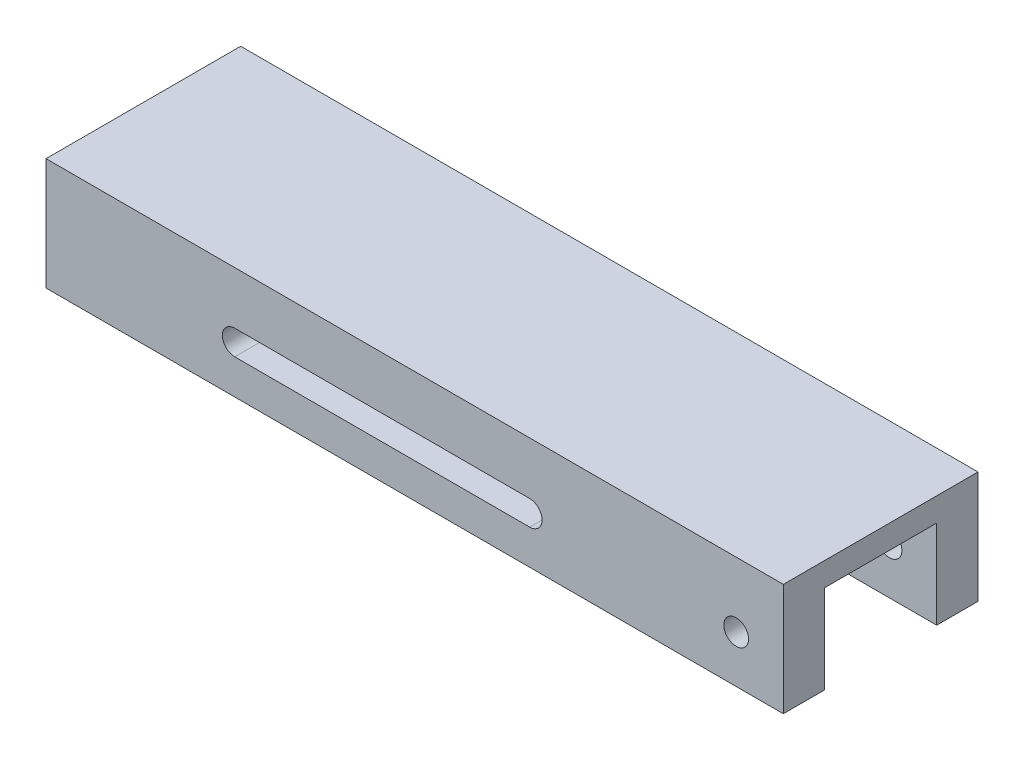
ISO-10303-21;
HEADER;
FILE_DESCRIPTION(('STEP AP214'),'2;1');
FILE_NAME('part.step','',(''),(''),'','','');
FILE_SCHEMA(('AUTOMOTIVE_DESIGN { 1 0 10303 214 1 1 1 1 }'));
ENDSEC;
DATA;
#1=APPLICATION_CONTEXT('core data for automotive mechanical design processes');
#2=APPLICATION_PROTOCOL_DEFINITION('international standard','automotive_design',2000,#1);
#3=PRODUCT_CONTEXT('',#1,'mechanical');
#4=PRODUCT('Part','Part','',(#3));
#5=PRODUCT_RELATED_PRODUCT_CATEGORY('part','',(#4));
#6=PRODUCT_DEFINITION_FORMATION('','',#4);
#7=PRODUCT_DEFINITION_CONTEXT('part definition',#1,'design');
#8=PRODUCT_DEFINITION('design','',#6,#7);
#9=PRODUCT_DEFINITION_SHAPE('','',#8);
#10=(LENGTH_UNIT() NAMED_UNIT(*) SI_UNIT(.MILLI.,.METRE.));
#11=(NAMED_UNIT(*) PLANE_ANGLE_UNIT() SI_UNIT($,.RADIAN.));
#12=(NAMED_UNIT(*) SI_UNIT($,.STERADIAN.) SOLID_ANGLE_UNIT());
#13=UNCERTAINTY_MEASURE_WITH_UNIT(LENGTH_MEASURE(1.E-05),#10,'distance_accuracy_value','');
#14=(GEOMETRIC_REPRESENTATION_CONTEXT(3) GLOBAL_UNCERTAINTY_ASSIGNED_CONTEXT((#13)) GLOBAL_UNIT_ASSIGNED_CONTEXT((#10,
#11,#12)) REPRESENTATION_CONTEXT('',''));
#15=CARTESIAN_POINT('',(0.,0.,0.));
#16=DIRECTION('',(0.,0.,1.));
#17=DIRECTION('',(1.,0.,0.));
#18=AXIS2_PLACEMENT_3D('',#15,#16,#17);
#19=CARTESIAN_POINT('',(125.,15.,-7.00000000000001));
#20=DIRECTION('',(0.,0.,1.));
#21=DIRECTION('',(1.,0.,0.));
#22=AXIS2_PLACEMENT_3D('',#19,#20,#21);
#23=PLANE('',#22);
#24=DIRECTION('',(1.,0.,0.));
#25=VECTOR('',#24,1.);
#26=CARTESIAN_POINT('',(125.,5.9,-7.00000000000001));
#27=LINE('',#26,#25);
#28=CARTESIAN_POINT('',(32.,5.89999999999999,-6.99999999999999));
#29=VERTEX_POINT('',#28);
#30=CARTESIAN_POINT('',(82.,5.89999999999999,-7.));
#31=VERTEX_POINT('',#30);
#32=EDGE_CURVE('E318',#29,#31,#27,.T.);
#33=ORIENTED_EDGE('',*,*,#32,.T.);
#34=CARTESIAN_POINT('',(82.,8.,-7.));
#35=DIRECTION('',(0.,0.,1.));
#36=DIRECTION('',(1.,0.,0.));
#37=AXIS2_PLACEMENT_3D('',#34,#35,#36);
#38=CIRCLE('',#37,2.1);
#39=CARTESIAN_POINT('',(82.,10.1,-7.));
#40=VERTEX_POINT('',#39);
#41=EDGE_CURVE('E326',#31,#40,#38,.T.);
#42=ORIENTED_EDGE('',*,*,#41,.T.);
#43=DIRECTION('',(-1.,0.,0.));
#44=VECTOR('',#43,1.);
#45=CARTESIAN_POINT('',(125.,10.1,-7.00000000000001));
#46=LINE('',#45,#44);
#47=CARTESIAN_POINT('',(32.,10.1,-6.99999999999999));
#48=VERTEX_POINT('',#47);
#49=EDGE_CURVE('E302',#40,#48,#46,.T.);
#50=ORIENTED_EDGE('',*,*,#49,.T.);
#51=CARTESIAN_POINT('',(32.,7.99999999999999,-6.99999999999999));
#52=DIRECTION('',(0.,0.,1.));
#53=DIRECTION('',(1.,0.,0.));
#54=AXIS2_PLACEMENT_3D('',#51,#52,#53);
#55=CIRCLE('',#54,2.1);
#56=EDGE_CURVE('E310',#48,#29,#55,.T.);
#57=ORIENTED_EDGE('',*,*,#56,.T.);
#58=EDGE_LOOP('',(#33,#42,#50,#57));
#59=FACE_BOUND('',#58,.T.);
#60=DIRECTION('',(0.,1.,0.));
#61=VECTOR('',#60,1.);
#62=CARTESIAN_POINT('',(90.,0.,-7.00000000000001));
#63=LINE('',#62,#61);
#64=CARTESIAN_POINT('',(90.,0.,-7.));
#65=VERTEX_POINT('',#64);
#66=CARTESIAN_POINT('',(90.,15.,-7.));
#67=VERTEX_POINT('',#66);
#68=EDGE_CURVE('E55',#65,#67,#63,.T.);
#69=ORIENTED_EDGE('',*,*,#68,.F.);
#70=DIRECTION('',(-1.,0.,0.));
#71=VECTOR('',#70,1.);
#72=CARTESIAN_POINT('',(125.,0.,-7.00000000000001));
#73=LINE('',#72,#71);
#74=CARTESIAN_POINT('',(7.,0.,-6.99999999999999));
#75=VERTEX_POINT('',#74);
#76=EDGE_CURVE('E357',#65,#75,#73,.T.);
#77=ORIENTED_EDGE('',*,*,#76,.T.);
#78=DIRECTION('',(0.,-1.,0.));
#79=VECTOR('',#78,1.);
#80=CARTESIAN_POINT('',(7.,15.,-6.99999999999999));
#81=LINE('',#80,#79);
#82=CARTESIAN_POINT('',(7.,15.,-6.99999999999999));
#83=VERTEX_POINT('',#82);
#84=EDGE_CURVE('E388',#83,#75,#81,.T.);
#85=ORIENTED_EDGE('',*,*,#84,.F.);
#86=DIRECTION('',(-1.,0.,0.));
#87=VECTOR('',#86,1.);
#88=CARTESIAN_POINT('',(125.,15.,-7.00000000000001));
#89=LINE('',#88,#87);
#90=EDGE_CURVE('E189',#67,#83,#89,.T.);
#91=ORIENTED_EDGE('',*,*,#90,.F.);
#92=EDGE_LOOP('',(#69,#77,#85,#91));
#93=FACE_BOUND('',#92,.T.);
#94=ADVANCED_FACE('F39',(#59,#93),#23,.F.);
#95=CARTESIAN_POINT('',(117.,8.,-7.00000000000001));
#96=DIRECTION('',(0.,0.,1.));
#97=DIRECTION('',(1.,0.,0.));
#98=AXIS2_PLACEMENT_3D('',#95,#96,#97);
#99=CIRCLE('',#98,2.09999999999999);
#100=CARTESIAN_POINT('',(119.1,8.,-7.00000000000001));
#101=VERTEX_POINT('',#100);
#102=EDGE_CURVE('E334',#101,#101,#99,.T.);
#103=ORIENTED_EDGE('',*,*,#102,.T.);
#104=EDGE_LOOP('',(#103));
#105=FACE_BOUND('',#104,.T.);
#106=DIRECTION('',(0.,1.,0.));
#107=VECTOR('',#106,1.);
#108=CARTESIAN_POINT('',(97.,0.,-7.00000000000001));
#109=LINE('',#108,#107);
#110=CARTESIAN_POINT('',(97.,0.,-7.));
#111=VERTEX_POINT('',#110);
#112=CARTESIAN_POINT('',(97.,15.,-7.00000000000001));
#113=VERTEX_POINT('',#112);
#114=EDGE_CURVE('E192',#111,#113,#109,.T.);
#115=ORIENTED_EDGE('',*,*,#114,.T.);
#116=CARTESIAN_POINT('',(125.,15.,-7.00000000000001));
#117=VERTEX_POINT('',#116);
#118=EDGE_CURVE('E180',#117,#113,#89,.T.);
#119=ORIENTED_EDGE('',*,*,#118,.F.);
#120=DIRECTION('',(0.,-1.,0.));
#121=VECTOR('',#120,1.);
#122=CARTESIAN_POINT('',(125.,15.,-7.00000000000001));
#123=LINE('',#122,#121);
#124=CARTESIAN_POINT('',(125.,0.,-7.00000000000001));
#125=VERTEX_POINT('',#124);
#126=EDGE_CURVE('E392',#117,#125,#123,.T.);
#127=ORIENTED_EDGE('',*,*,#126,.T.);
#128=EDGE_CURVE('E63',#125,#111,#73,.T.);
#129=ORIENTED_EDGE('',*,*,#128,.T.);
#130=EDGE_LOOP('',(#115,#119,#127,#129));
#131=FACE_BOUND('',#130,.T.);
#132=ADVANCED_FACE('F193',(#105,#131),#23,.F.);
#133=CARTESIAN_POINT('',(125.,15.,-26.));
#134=DIRECTION('',(0.,0.,-1.));
#135=DIRECTION('',(-1.,0.,0.));
#136=AXIS2_PLACEMENT_3D('',#133,#134,#135);
#137=PLANE('',#136);
#138=DIRECTION('',(1.,0.,0.));
#139=VECTOR('',#138,1.);
#140=CARTESIAN_POINT('',(125.,10.1,-26.));
#141=LINE('',#140,#139);
#142=CARTESIAN_POINT('',(32.,10.1,-26.));
#143=VERTEX_POINT('',#142);
#144=CARTESIAN_POINT('',(82.,10.1,-26.));
#145=VERTEX_POINT('',#144);
#146=EDGE_CURVE('E245',#143,#145,#141,.T.);
#147=ORIENTED_EDGE('',*,*,#146,.T.);
#148=CARTESIAN_POINT('',(82.,8.,-26.));
#149=DIRECTION('',(0.,0.,-1.));
#150=DIRECTION('',(-1.,0.,0.));
#151=AXIS2_PLACEMENT_3D('',#148,#149,#150);
#152=CIRCLE('',#151,2.1);
#153=CARTESIAN_POINT('',(82.,5.89999999999999,-26.));
#154=VERTEX_POINT('',#153);
#155=EDGE_CURVE('E322',#145,#154,#152,.T.);
#156=ORIENTED_EDGE('',*,*,#155,.T.);
#157=DIRECTION('',(-1.,0.,0.));
#158=VECTOR('',#157,1.);
#159=CARTESIAN_POINT('',(125.,5.9,-26.));
#160=LINE('',#159,#158);
#161=CARTESIAN_POINT('',(32.,5.89999999999999,-26.));
#162=VERTEX_POINT('',#161);
#163=EDGE_CURVE('E314',#154,#162,#160,.T.);
#164=ORIENTED_EDGE('',*,*,#163,.T.);
#165=CARTESIAN_POINT('',(32.,7.99999999999999,-26.));
#166=DIRECTION('',(0.,0.,-1.));
#167=DIRECTION('',(-1.,0.,0.));
#168=AXIS2_PLACEMENT_3D('',#165,#166,#167);
#169=CIRCLE('',#168,2.1);
#170=EDGE_CURVE('E306',#162,#143,#169,.T.);
#171=ORIENTED_EDGE('',*,*,#170,.T.);
#172=EDGE_LOOP('',(#147,#156,#164,#171));
#173=FACE_BOUND('',#172,.T.);
#174=DIRECTION('',(0.,1.,0.));
#175=VECTOR('',#174,1.);
#176=CARTESIAN_POINT('',(90.,0.,-26.));
#177=LINE('',#176,#175);
#178=CARTESIAN_POINT('',(90.,0.,-26.));
#179=VERTEX_POINT('',#178);
#180=CARTESIAN_POINT('',(90.,15.,-26.));
#181=VERTEX_POINT('',#180);
#182=EDGE_CURVE('E219',#179,#181,#177,.T.);
#183=ORIENTED_EDGE('',*,*,#182,.T.);
#184=DIRECTION('',(1.,0.,0.));
#185=VECTOR('',#184,1.);
#186=CARTESIAN_POINT('',(125.,15.,-26.));
#187=LINE('',#186,#185);
#188=CARTESIAN_POINT('',(7.00000000000001,15.,-26.));
#189=VERTEX_POINT('',#188);
#190=EDGE_CURVE('E343',#189,#181,#187,.T.);
#191=ORIENTED_EDGE('',*,*,#190,.F.);
#192=DIRECTION('',(0.,-1.,0.));
#193=VECTOR('',#192,1.);
#194=CARTESIAN_POINT('',(7.00000000000001,15.,-26.));
#195=LINE('',#194,#193);
#196=CARTESIAN_POINT('',(7.00000000000001,0.,-26.));
#197=VERTEX_POINT('',#196);
#198=EDGE_CURVE('E384',#189,#197,#195,.T.);
#199=ORIENTED_EDGE('',*,*,#198,.T.);
#200=DIRECTION('',(1.,0.,0.));
#201=VECTOR('',#200,1.);
#202=CARTESIAN_POINT('',(125.,0.,-26.));
#203=LINE('',#202,#201);
#204=EDGE_CURVE('E364',#197,#179,#203,.T.);
#205=ORIENTED_EDGE('',*,*,#204,.T.);
#206=EDGE_LOOP('',(#183,#191,#199,#205));
#207=FACE_BOUND('',#206,.T.);
#208=ADVANCED_FACE('F446',(#173,#207),#137,.F.);
#209=CARTESIAN_POINT('',(117.,8.,-26.));
#210=DIRECTION('',(0.,0.,-1.));
#211=DIRECTION('',(-1.,0.,0.));
#212=AXIS2_PLACEMENT_3D('',#209,#210,#211);
#213=CIRCLE('',#212,2.09999999999999);
#214=CARTESIAN_POINT('',(114.9,8.,-26.));
#215=VERTEX_POINT('',#214);
#216=EDGE_CURVE('E330',#215,#215,#213,.T.);
#217=ORIENTED_EDGE('',*,*,#216,.T.);
#218=EDGE_LOOP('',(#217));
#219=FACE_BOUND('',#218,.T.);
#220=DIRECTION('',(0.,1.,0.));
#221=VECTOR('',#220,1.);
#222=CARTESIAN_POINT('',(97.,0.,-26.));
#223=LINE('',#222,#221);
#224=CARTESIAN_POINT('',(97.,0.,-26.));
#225=VERTEX_POINT('',#224);
#226=CARTESIAN_POINT('',(97.,15.,-26.));
#227=VERTEX_POINT('',#226);
#228=EDGE_CURVE('E197',#225,#227,#223,.T.);
#229=ORIENTED_EDGE('',*,*,#228,.F.);
#230=CARTESIAN_POINT('',(125.,0.,-26.));
#231=VERTEX_POINT('',#230);
#232=EDGE_CURVE('E363',#225,#231,#203,.T.);
#233=ORIENTED_EDGE('',*,*,#232,.T.);
#234=DIRECTION('',(0.,-1.,0.));
#235=VECTOR('',#234,1.);
#236=CARTESIAN_POINT('',(125.,15.,-26.));
#237=LINE('',#236,#235);
#238=CARTESIAN_POINT('',(125.,15.,-26.));
#239=VERTEX_POINT('',#238);
#240=EDGE_CURVE('E380',#239,#231,#237,.T.);
#241=ORIENTED_EDGE('',*,*,#240,.F.);
#242=EDGE_CURVE('E342',#227,#239,#187,.T.);
#243=ORIENTED_EDGE('',*,*,#242,.F.);
#244=EDGE_LOOP('',(#229,#233,#241,#243));
#245=FACE_BOUND('',#244,.T.);
#246=ADVANCED_FACE('F531',(#219,#245),#137,.F.);
#247=CARTESIAN_POINT('',(0.,15.,0.));
#248=DIRECTION('',(0.,1.,0.));
#249=DIRECTION('',(0.,0.,1.));
#250=AXIS2_PLACEMENT_3D('',#247,#248,#249);
#251=PLANE('',#250);
#252=DIRECTION('',(0.,0.,-1.));
#253=VECTOR('',#252,1.);
#254=CARTESIAN_POINT('',(90.,15.,-7.00000000000001));
#255=LINE('',#254,#253);
#256=EDGE_CURVE('E203',#67,#181,#255,.T.);
#257=ORIENTED_EDGE('',*,*,#256,.F.);
#258=ORIENTED_EDGE('',*,*,#90,.T.);
#259=DIRECTION('',(0.,0.,-1.));
#260=VECTOR('',#259,1.);
#261=CARTESIAN_POINT('',(7.00000000000001,15.,-26.));
#262=LINE('',#261,#260);
#263=EDGE_CURVE('E188',#83,#189,#262,.T.);
#264=ORIENTED_EDGE('',*,*,#263,.T.);
#265=ORIENTED_EDGE('',*,*,#190,.T.);
#266=EDGE_LOOP('',(#257,#258,#264,#265));
#267=FACE_BOUND('',#266,.T.);
#268=ADVANCED_FACE('F452',(#267),#251,.F.);
#269=DIRECTION('',(0.,0.,1.));
#270=VECTOR('',#269,1.);
#271=CARTESIAN_POINT('',(97.,15.,-7.00000000000001));
#272=LINE('',#271,#270);
#273=EDGE_CURVE('E183',#227,#113,#272,.T.);
#274=ORIENTED_EDGE('',*,*,#273,.F.);
#275=ORIENTED_EDGE('',*,*,#242,.T.);
#276=DIRECTION('',(0.,0.,-1.));
#277=VECTOR('',#276,1.);
#278=CARTESIAN_POINT('',(125.,15.,-33.));
#279=LINE('',#278,#277);
#280=EDGE_CURVE('E186',#117,#239,#279,.T.);
#281=ORIENTED_EDGE('',*,*,#280,.F.);
#282=ORIENTED_EDGE('',*,*,#118,.T.);
#283=EDGE_LOOP('',(#274,#275,#281,#282));
#284=FACE_BOUND('',#283,.T.);
#285=ADVANCED_FACE('F181',(#284),#251,.F.);
#286=CARTESIAN_POINT('',(0.,15.,0.));
#287=DIRECTION('',(1.,0.,0.));
#288=DIRECTION('',(0.,0.,-1.));
#289=AXIS2_PLACEMENT_3D('',#286,#287,#288);
#290=PLANE('',#289);
#291=CARTESIAN_POINT('',(0.,8.,-16.5));
#292=DIRECTION('',(1.,0.,0.));
#293=DIRECTION('',(0.,0.,-1.));
#294=AXIS2_PLACEMENT_3D('',#291,#292,#293);
#295=CIRCLE('',#294,3.575);
#296=CARTESIAN_POINT('',(0.,8.,-20.075));
#297=VERTEX_POINT('',#296);
#298=EDGE_CURVE('E421',#297,#297,#295,.T.);
#299=ORIENTED_EDGE('',*,*,#298,.T.);
#300=EDGE_LOOP('',(#299));
#301=FACE_BOUND('',#300,.T.);
#302=DIRECTION('',(0.,0.,1.));
#303=VECTOR('',#302,1.);
#304=CARTESIAN_POINT('',(0.,0.,0.));
#305=LINE('',#304,#303);
#306=CARTESIAN_POINT('',(0.,0.,-33.));
#307=VERTEX_POINT('',#306);
#308=CARTESIAN_POINT('',(0.,0.,0.));
#309=VERTEX_POINT('',#308);
#310=EDGE_CURVE('E337',#307,#309,#305,.T.);
#311=ORIENTED_EDGE('',*,*,#310,.T.);
#312=DIRECTION('',(0.,-1.,0.));
#313=VECTOR('',#312,1.);
#314=CARTESIAN_POINT('',(0.,15.,0.));
#315=LINE('',#314,#313);
#316=CARTESIAN_POINT('',(0.,19.,0.));
#317=VERTEX_POINT('',#316);
#318=EDGE_CURVE('E11',#317,#309,#315,.T.);
#319=ORIENTED_EDGE('',*,*,#318,.F.);
#320=DIRECTION('',(0.,0.,1.));
#321=VECTOR('',#320,1.);
#322=CARTESIAN_POINT('',(0.,19.,-33.));
#323=LINE('',#322,#321);
#324=CARTESIAN_POINT('',(0.,19.,-33.));
#325=VERTEX_POINT('',#324);
#326=EDGE_CURVE('E222',#325,#317,#323,.T.);
#327=ORIENTED_EDGE('',*,*,#326,.F.);
#328=DIRECTION('',(0.,-1.,0.));
#329=VECTOR('',#328,1.);
#330=CARTESIAN_POINT('',(0.,15.,-33.));
#331=LINE('',#330,#329);
#332=EDGE_CURVE('E347',#325,#307,#331,.T.);
#333=ORIENTED_EDGE('',*,*,#332,.T.);
#334=EDGE_LOOP('',(#311,#319,#327,#333));
#335=FACE_BOUND('',#334,.T.);
#336=ADVANCED_FACE('F41',(#301,#335),#290,.F.);
#337=CARTESIAN_POINT('',(0.,15.,0.));
#338=DIRECTION('',(0.,0.,-1.));
#339=DIRECTION('',(-1.,0.,0.));
#340=AXIS2_PLACEMENT_3D('',#337,#338,#339);
#341=PLANE('',#340);
#342=CARTESIAN_POINT('',(117.,8.,0.));
#343=DIRECTION('',(0.,0.,1.));
#344=DIRECTION('',(1.,0.,0.));
#345=AXIS2_PLACEMENT_3D('',#342,#343,#344);
#346=CIRCLE('',#345,2.09999999999999);
#347=CARTESIAN_POINT('',(119.1,8.,0.));
#348=VERTEX_POINT('',#347);
#349=EDGE_CURVE('E246',#348,#348,#346,.T.);
#350=ORIENTED_EDGE('',*,*,#349,.F.);
#351=EDGE_LOOP('',(#350));
#352=FACE_BOUND('',#351,.T.);
#353=DIRECTION('',(-1.,0.,0.));
#354=VECTOR('',#353,1.);
#355=CARTESIAN_POINT('',(82.,10.1,0.));
#356=LINE('',#355,#354);
#357=CARTESIAN_POINT('',(82.,10.1,0.));
#358=VERTEX_POINT('',#357);
#359=CARTESIAN_POINT('',(32.,10.1,0.));
#360=VERTEX_POINT('',#359);
#361=EDGE_CURVE('E271',#358,#360,#356,.T.);
#362=ORIENTED_EDGE('',*,*,#361,.F.);
#363=CARTESIAN_POINT('',(82.,8.,0.));
#364=DIRECTION('',(0.,0.,1.));
#365=DIRECTION('',(1.,0.,0.));
#366=AXIS2_PLACEMENT_3D('',#363,#364,#365);
#367=CIRCLE('',#366,2.1);
#368=CARTESIAN_POINT('',(82.,5.89999999999999,0.));
#369=VERTEX_POINT('',#368);
#370=EDGE_CURVE('E238',#369,#358,#367,.T.);
#371=ORIENTED_EDGE('',*,*,#370,.F.);
#372=DIRECTION('',(1.,0.,0.));
#373=VECTOR('',#372,1.);
#374=CARTESIAN_POINT('',(82.,5.89999999999999,0.));
#375=LINE('',#374,#373);
#376=CARTESIAN_POINT('',(32.,5.89999999999999,0.));
#377=VERTEX_POINT('',#376);
#378=EDGE_CURVE('E256',#377,#369,#375,.T.);
#379=ORIENTED_EDGE('',*,*,#378,.F.);
#380=CARTESIAN_POINT('',(32.,7.99999999999999,0.));
#381=DIRECTION('',(0.,0.,1.));
#382=DIRECTION('',(1.,0.,0.));
#383=AXIS2_PLACEMENT_3D('',#380,#381,#382);
#384=CIRCLE('',#383,2.1);
#385=EDGE_CURVE('E275',#360,#377,#384,.T.);
#386=ORIENTED_EDGE('',*,*,#385,.F.);
#387=EDGE_LOOP('',(#362,#371,#379,#386));
#388=FACE_BOUND('',#387,.T.);
#389=DIRECTION('',(1.,0.,0.));
#390=VECTOR('',#389,1.);
#391=CARTESIAN_POINT('',(0.,0.,0.));
#392=LINE('',#391,#390);
#393=CARTESIAN_POINT('',(125.,0.,0.));
#394=VERTEX_POINT('',#393);
#395=EDGE_CURVE('E351',#309,#394,#392,.T.);
#396=ORIENTED_EDGE('',*,*,#395,.T.);
#397=DIRECTION('',(0.,-1.,0.));
#398=VECTOR('',#397,1.);
#399=CARTESIAN_POINT('',(125.,15.,0.));
#400=LINE('',#399,#398);
#401=CARTESIAN_POINT('',(125.,19.,0.));
#402=VERTEX_POINT('',#401);
#403=EDGE_CURVE('E48',#402,#394,#400,.T.);
#404=ORIENTED_EDGE('',*,*,#403,.F.);
#405=DIRECTION('',(1.,0.,0.));
#406=VECTOR('',#405,1.);
#407=CARTESIAN_POINT('',(0.,19.,0.));
#408=LINE('',#407,#406);
#409=EDGE_CURVE('E226',#317,#402,#408,.T.);
#410=ORIENTED_EDGE('',*,*,#409,.F.);
#411=ORIENTED_EDGE('',*,*,#318,.T.);
#412=EDGE_LOOP('',(#396,#404,#410,#411));
#413=FACE_BOUND('',#412,.T.);
#414=ADVANCED_FACE('F438',(#352,#388,#413),#341,.F.);
#415=CARTESIAN_POINT('',(7.00000000000001,15.,-26.));
#416=DIRECTION('',(-1.,0.,0.));
#417=DIRECTION('',(0.,0.,1.));
#418=AXIS2_PLACEMENT_3D('',#415,#416,#417);
#419=PLANE('',#418);
#420=CARTESIAN_POINT('',(7.00000000000001,8.,-16.5));
#421=DIRECTION('',(-1.,0.,0.));
#422=DIRECTION('',(0.,0.,1.));
#423=AXIS2_PLACEMENT_3D('',#420,#421,#422);
#424=CIRCLE('',#423,3.575);
#425=CARTESIAN_POINT('',(7.00000000000001,8.,-12.925));
#426=VERTEX_POINT('',#425);
#427=EDGE_CURVE('E211',#426,#426,#424,.F.);
#428=ORIENTED_EDGE('',*,*,#427,.F.);
#429=EDGE_LOOP('',(#428));
#430=FACE_BOUND('',#429,.T.);
#431=DIRECTION('',(0.,0.,-1.));
#432=VECTOR('',#431,1.);
#433=CARTESIAN_POINT('',(7.00000000000001,0.,-26.));
#434=LINE('',#433,#432);
#435=EDGE_CURVE('E360',#75,#197,#434,.T.);
#436=ORIENTED_EDGE('',*,*,#435,.T.);
#437=ORIENTED_EDGE('',*,*,#198,.F.);
#438=ORIENTED_EDGE('',*,*,#263,.F.);
#439=ORIENTED_EDGE('',*,*,#84,.T.);
#440=EDGE_LOOP('',(#436,#437,#438,#439));
#441=FACE_BOUND('',#440,.T.);
#442=ADVANCED_FACE('F435',(#430,#441),#419,.F.);
#443=CARTESIAN_POINT('',(125.,15.,-26.));
#444=DIRECTION('',(-1.,0.,0.));
#445=DIRECTION('',(0.,0.,1.));
#446=AXIS2_PLACEMENT_3D('',#443,#444,#445);
#447=PLANE('',#446);
#448=DIRECTION('',(0.,0.,-1.));
#449=VECTOR('',#448,1.);
#450=CARTESIAN_POINT('',(125.,0.,-26.));
#451=LINE('',#450,#449);
#452=CARTESIAN_POINT('',(125.,0.,-33.));
#453=VERTEX_POINT('',#452);
#454=EDGE_CURVE('E367',#231,#453,#451,.T.);
#455=ORIENTED_EDGE('',*,*,#454,.T.);
#456=DIRECTION('',(0.,-1.,0.));
#457=VECTOR('',#456,1.);
#458=CARTESIAN_POINT('',(125.,15.,-33.));
#459=LINE('',#458,#457);
#460=CARTESIAN_POINT('',(125.,19.,-33.));
#461=VERTEX_POINT('',#460);
#462=EDGE_CURVE('E376',#461,#453,#459,.T.);
#463=ORIENTED_EDGE('',*,*,#462,.F.);
#464=DIRECTION('',(0.,0.,-1.));
#465=VECTOR('',#464,1.);
#466=CARTESIAN_POINT('',(125.,19.,-33.));
#467=LINE('',#466,#465);
#468=EDGE_CURVE('E230',#402,#461,#467,.T.);
#469=ORIENTED_EDGE('',*,*,#468,.F.);
#470=ORIENTED_EDGE('',*,*,#403,.T.);
#471=DIRECTION('',(0.,0.,-1.));
#472=VECTOR('',#471,1.);
#473=CARTESIAN_POINT('',(125.,0.,0.));
#474=LINE('',#473,#472);
#475=EDGE_CURVE('E354',#394,#125,#474,.T.);
#476=ORIENTED_EDGE('',*,*,#475,.T.);
#477=ORIENTED_EDGE('',*,*,#126,.F.);
#478=ORIENTED_EDGE('',*,*,#280,.T.);
#479=ORIENTED_EDGE('',*,*,#240,.T.);
#480=EDGE_LOOP('',(#455,#463,#469,#470,#476,#477,#478,#479));
#481=FACE_BOUND('',#480,.T.);
#482=ADVANCED_FACE('F399',(#481),#447,.F.);
#483=CARTESIAN_POINT('',(0.,15.,-33.));
#484=DIRECTION('',(0.,0.,1.));
#485=DIRECTION('',(1.,0.,0.));
#486=AXIS2_PLACEMENT_3D('',#483,#484,#485);
#487=PLANE('',#486);
#488=CARTESIAN_POINT('',(117.,8.,-33.));
#489=DIRECTION('',(0.,0.,1.));
#490=DIRECTION('',(1.,0.,0.));
#491=AXIS2_PLACEMENT_3D('',#488,#489,#490);
#492=CIRCLE('',#491,2.09999999999999);
#493=CARTESIAN_POINT('',(119.1,8.,-33.));
#494=VERTEX_POINT('',#493);
#495=EDGE_CURVE('E241',#494,#494,#492,.T.);
#496=ORIENTED_EDGE('',*,*,#495,.T.);
#497=EDGE_LOOP('',(#496));
#498=FACE_BOUND('',#497,.T.);
#499=DIRECTION('',(1.,0.,0.));
#500=VECTOR('',#499,1.);
#501=CARTESIAN_POINT('',(82.,5.89999999999999,-33.));
#502=LINE('',#501,#500);
#503=CARTESIAN_POINT('',(32.,5.89999999999999,-33.));
#504=VERTEX_POINT('',#503);
#505=CARTESIAN_POINT('',(82.,5.89999999999999,-33.));
#506=VERTEX_POINT('',#505);
#507=EDGE_CURVE('E264',#504,#506,#502,.T.);
#508=ORIENTED_EDGE('',*,*,#507,.T.);
#509=CARTESIAN_POINT('',(82.,8.,-33.));
#510=DIRECTION('',(0.,0.,1.));
#511=DIRECTION('',(1.,0.,0.));
#512=AXIS2_PLACEMENT_3D('',#509,#510,#511);
#513=CIRCLE('',#512,2.1);
#514=CARTESIAN_POINT('',(82.,10.1,-33.));
#515=VERTEX_POINT('',#514);
#516=EDGE_CURVE('E251',#506,#515,#513,.T.);
#517=ORIENTED_EDGE('',*,*,#516,.T.);
#518=DIRECTION('',(-1.,0.,0.));
#519=VECTOR('',#518,1.);
#520=CARTESIAN_POINT('',(82.,10.1,-33.));
#521=LINE('',#520,#519);
#522=CARTESIAN_POINT('',(32.,10.1,-33.));
#523=VERTEX_POINT('',#522);
#524=EDGE_CURVE('E255',#515,#523,#521,.T.);
#525=ORIENTED_EDGE('',*,*,#524,.T.);
#526=CARTESIAN_POINT('',(32.,7.99999999999999,-33.));
#527=DIRECTION('',(0.,0.,1.));
#528=DIRECTION('',(1.,0.,0.));
#529=AXIS2_PLACEMENT_3D('',#526,#527,#528);
#530=CIRCLE('',#529,2.1);
#531=EDGE_CURVE('E260',#523,#504,#530,.T.);
#532=ORIENTED_EDGE('',*,*,#531,.T.);
#533=EDGE_LOOP('',(#508,#517,#525,#532));
#534=FACE_BOUND('',#533,.T.);
#535=DIRECTION('',(-1.,0.,0.));
#536=VECTOR('',#535,1.);
#537=CARTESIAN_POINT('',(0.,0.,-33.));
#538=LINE('',#537,#536);
#539=EDGE_CURVE('E370',#453,#307,#538,.T.);
#540=ORIENTED_EDGE('',*,*,#539,.T.);
#541=ORIENTED_EDGE('',*,*,#332,.F.);
#542=DIRECTION('',(-1.,0.,0.));
#543=VECTOR('',#542,1.);
#544=CARTESIAN_POINT('',(0.,19.,-33.));
#545=LINE('',#544,#543);
#546=EDGE_CURVE('E234',#461,#325,#545,.T.);
#547=ORIENTED_EDGE('',*,*,#546,.F.);
#548=ORIENTED_EDGE('',*,*,#462,.T.);
#549=EDGE_LOOP('',(#540,#541,#547,#548));
#550=FACE_BOUND('',#549,.T.);
#551=ADVANCED_FACE('F539',(#498,#534,#550),#487,.F.);
#552=CARTESIAN_POINT('',(0.,0.,0.));
#553=DIRECTION('',(0.,-1.,0.));
#554=DIRECTION('',(0.,0.,-1.));
#555=AXIS2_PLACEMENT_3D('',#552,#553,#554);
#556=PLANE('',#555);
#557=ORIENTED_EDGE('',*,*,#232,.F.);
#558=DIRECTION('',(0.,0.,1.));
#559=VECTOR('',#558,1.);
#560=CARTESIAN_POINT('',(97.,0.,-7.00000000000001));
#561=LINE('',#560,#559);
#562=EDGE_CURVE('E208',#225,#111,#561,.T.);
#563=ORIENTED_EDGE('',*,*,#562,.T.);
#564=ORIENTED_EDGE('',*,*,#128,.F.);
#565=ORIENTED_EDGE('',*,*,#475,.F.);
#566=ORIENTED_EDGE('',*,*,#395,.F.);
#567=ORIENTED_EDGE('',*,*,#310,.F.);
#568=ORIENTED_EDGE('',*,*,#539,.F.);
#569=ORIENTED_EDGE('',*,*,#454,.F.);
#570=EDGE_LOOP('',(#557,#563,#564,#565,#566,#567,#568,#569));
#571=FACE_BOUND('',#570,.T.);
#572=DIRECTION('',(0.,0.,-1.));
#573=VECTOR('',#572,1.);
#574=CARTESIAN_POINT('',(90.,0.,-7.00000000000001));
#575=LINE('',#574,#573);
#576=EDGE_CURVE('E202',#65,#179,#575,.T.);
#577=ORIENTED_EDGE('',*,*,#576,.T.);
#578=ORIENTED_EDGE('',*,*,#204,.F.);
#579=ORIENTED_EDGE('',*,*,#435,.F.);
#580=ORIENTED_EDGE('',*,*,#76,.F.);
#581=EDGE_LOOP('',(#577,#578,#579,#580));
#582=FACE_BOUND('',#581,.T.);
#583=ADVANCED_FACE('F404',(#571,#582),#556,.T.);
#584=CARTESIAN_POINT('',(82.,10.1,-33.));
#585=DIRECTION('',(0.,1.,0.));
#586=DIRECTION('',(-1.,0.,0.));
#587=AXIS2_PLACEMENT_3D('',#584,#585,#586);
#588=PLANE('',#587);
#589=DIRECTION('',(0.,0.,1.));
#590=VECTOR('',#589,1.);
#591=CARTESIAN_POINT('',(32.,10.1,-33.));
#592=LINE('',#591,#590);
#593=EDGE_CURVE('E291',#523,#143,#592,.T.);
#594=ORIENTED_EDGE('',*,*,#593,.F.);
#595=ORIENTED_EDGE('',*,*,#524,.F.);
#596=DIRECTION('',(0.,0.,1.));
#597=VECTOR('',#596,1.);
#598=CARTESIAN_POINT('',(82.,10.1,-33.));
#599=LINE('',#598,#597);
#600=EDGE_CURVE('E296',#515,#145,#599,.T.);
#601=ORIENTED_EDGE('',*,*,#600,.T.);
#602=ORIENTED_EDGE('',*,*,#146,.F.);
#603=EDGE_LOOP('',(#594,#595,#601,#602));
#604=FACE_BOUND('',#603,.T.);
#605=ADVANCED_FACE('F519',(#604),#588,.F.);
#606=CARTESIAN_POINT('',(32.,7.99999999999999,-33.));
#607=DIRECTION('',(0.,0.,1.));
#608=DIRECTION('',(1.,0.,0.));
#609=AXIS2_PLACEMENT_3D('',#606,#607,#608);
#610=CYLINDRICAL_SURFACE('',#609,2.1);
#611=DIRECTION('',(0.,0.,1.));
#612=VECTOR('',#611,1.);
#613=CARTESIAN_POINT('',(32.,5.89999999999999,-33.));
#614=LINE('',#613,#612);
#615=EDGE_CURVE('E286',#504,#162,#614,.T.);
#616=ORIENTED_EDGE('',*,*,#615,.F.);
#617=ORIENTED_EDGE('',*,*,#531,.F.);
#618=ORIENTED_EDGE('',*,*,#593,.T.);
#619=ORIENTED_EDGE('',*,*,#170,.F.);
#620=EDGE_LOOP('',(#616,#617,#618,#619));
#621=FACE_BOUND('',#620,.T.);
#622=ADVANCED_FACE('F486',(#621),#610,.F.);
#623=CARTESIAN_POINT('',(82.,5.89999999999999,-33.));
#624=DIRECTION('',(0.,-1.,0.));
#625=DIRECTION('',(1.,0.,0.));
#626=AXIS2_PLACEMENT_3D('',#623,#624,#625);
#627=PLANE('',#626);
#628=DIRECTION('',(0.,0.,1.));
#629=VECTOR('',#628,1.);
#630=CARTESIAN_POINT('',(82.,5.89999999999999,-33.));
#631=LINE('',#630,#629);
#632=EDGE_CURVE('E250',#506,#154,#631,.T.);
#633=ORIENTED_EDGE('',*,*,#632,.F.);
#634=ORIENTED_EDGE('',*,*,#507,.F.);
#635=ORIENTED_EDGE('',*,*,#615,.T.);
#636=ORIENTED_EDGE('',*,*,#163,.F.);
#637=EDGE_LOOP('',(#633,#634,#635,#636));
#638=FACE_BOUND('',#637,.T.);
#639=ADVANCED_FACE('F480',(#638),#627,.F.);
#640=CARTESIAN_POINT('',(82.,8.,-33.));
#641=DIRECTION('',(0.,0.,1.));
#642=DIRECTION('',(1.,0.,0.));
#643=AXIS2_PLACEMENT_3D('',#640,#641,#642);
#644=CYLINDRICAL_SURFACE('',#643,2.1);
#645=ORIENTED_EDGE('',*,*,#600,.F.);
#646=ORIENTED_EDGE('',*,*,#516,.F.);
#647=ORIENTED_EDGE('',*,*,#632,.T.);
#648=ORIENTED_EDGE('',*,*,#155,.F.);
#649=EDGE_LOOP('',(#645,#646,#647,#648));
#650=FACE_BOUND('',#649,.T.);
#651=ADVANCED_FACE('F489',(#650),#644,.F.);
#652=CARTESIAN_POINT('',(117.,8.,-33.));
#653=DIRECTION('',(0.,0.,1.));
#654=DIRECTION('',(1.,0.,0.));
#655=AXIS2_PLACEMENT_3D('',#652,#653,#654);
#656=CYLINDRICAL_SURFACE('',#655,2.09999999999999);
#657=ORIENTED_EDGE('',*,*,#495,.F.);
#658=EDGE_LOOP('',(#657));
#659=FACE_BOUND('',#658,.T.);
#660=ORIENTED_EDGE('',*,*,#216,.F.);
#661=EDGE_LOOP('',(#660));
#662=FACE_BOUND('',#661,.T.);
#663=ADVANCED_FACE('F487',(#659,#662),#656,.F.);
#664=EDGE_CURVE('E285',#31,#369,#631,.T.);
#665=ORIENTED_EDGE('',*,*,#664,.T.);
#666=ORIENTED_EDGE('',*,*,#370,.T.);
#667=EDGE_CURVE('E268',#40,#358,#599,.T.);
#668=ORIENTED_EDGE('',*,*,#667,.F.);
#669=ORIENTED_EDGE('',*,*,#41,.F.);
#670=EDGE_LOOP('',(#665,#666,#668,#669));
#671=FACE_BOUND('',#670,.T.);
#672=ADVANCED_FACE('F475',(#671),#644,.F.);
#673=EDGE_CURVE('E290',#29,#377,#614,.T.);
#674=ORIENTED_EDGE('',*,*,#673,.T.);
#675=ORIENTED_EDGE('',*,*,#378,.T.);
#676=ORIENTED_EDGE('',*,*,#664,.F.);
#677=ORIENTED_EDGE('',*,*,#32,.F.);
#678=EDGE_LOOP('',(#674,#675,#676,#677));
#679=FACE_BOUND('',#678,.T.);
#680=ADVANCED_FACE('F477',(#679),#627,.F.);
#681=EDGE_CURVE('E295',#48,#360,#592,.T.);
#682=ORIENTED_EDGE('',*,*,#681,.T.);
#683=ORIENTED_EDGE('',*,*,#385,.T.);
#684=ORIENTED_EDGE('',*,*,#673,.F.);
#685=ORIENTED_EDGE('',*,*,#56,.F.);
#686=EDGE_LOOP('',(#682,#683,#684,#685));
#687=FACE_BOUND('',#686,.T.);
#688=ADVANCED_FACE('F471',(#687),#610,.F.);
#689=ORIENTED_EDGE('',*,*,#667,.T.);
#690=ORIENTED_EDGE('',*,*,#361,.T.);
#691=ORIENTED_EDGE('',*,*,#681,.F.);
#692=ORIENTED_EDGE('',*,*,#49,.F.);
#693=EDGE_LOOP('',(#689,#690,#691,#692));
#694=FACE_BOUND('',#693,.T.);
#695=ADVANCED_FACE('F463',(#694),#588,.F.);
#696=ORIENTED_EDGE('',*,*,#349,.T.);
#697=EDGE_LOOP('',(#696));
#698=FACE_BOUND('',#697,.T.);
#699=ORIENTED_EDGE('',*,*,#102,.F.);
#700=EDGE_LOOP('',(#699));
#701=FACE_BOUND('',#700,.T.);
#702=ADVANCED_FACE('F507',(#698,#701),#656,.F.);
#703=CARTESIAN_POINT('',(0.,19.,0.));
#704=DIRECTION('',(0.,1.,0.));
#705=DIRECTION('',(0.,0.,1.));
#706=AXIS2_PLACEMENT_3D('',#703,#704,#705);
#707=PLANE('',#706);
#708=ORIENTED_EDGE('',*,*,#326,.T.);
#709=ORIENTED_EDGE('',*,*,#409,.T.);
#710=ORIENTED_EDGE('',*,*,#468,.T.);
#711=ORIENTED_EDGE('',*,*,#546,.T.);
#712=EDGE_LOOP('',(#708,#709,#710,#711));
#713=FACE_BOUND('',#712,.T.);
#714=ADVANCED_FACE('F510',(#713),#707,.T.);
#715=CARTESIAN_POINT('',(90.,0.,-7.00000000000001));
#716=DIRECTION('',(1.,0.,0.));
#717=DIRECTION('',(0.,0.,-1.));
#718=AXIS2_PLACEMENT_3D('',#715,#716,#717);
#719=PLANE('',#718);
#720=CARTESIAN_POINT('',(90.,8.,-16.5));
#721=DIRECTION('',(1.,0.,0.));
#722=DIRECTION('',(0.,0.,-1.));
#723=AXIS2_PLACEMENT_3D('',#720,#721,#722);
#724=CIRCLE('',#723,3.575);
#725=CARTESIAN_POINT('',(90.,8.,-12.925));
#726=VERTEX_POINT('',#725);
#727=EDGE_CURVE('E413',#726,#726,#724,.F.);
#728=ORIENTED_EDGE('',*,*,#727,.F.);
#729=EDGE_LOOP('',(#728));
#730=FACE_BOUND('',#729,.T.);
#731=ORIENTED_EDGE('',*,*,#256,.T.);
#732=ORIENTED_EDGE('',*,*,#182,.F.);
#733=ORIENTED_EDGE('',*,*,#576,.F.);
#734=ORIENTED_EDGE('',*,*,#68,.T.);
#735=EDGE_LOOP('',(#731,#732,#733,#734));
#736=FACE_BOUND('',#735,.T.);
#737=ADVANCED_FACE('F450',(#730,#736),#719,.F.);
#738=CARTESIAN_POINT('',(97.,0.,-7.00000000000001));
#739=DIRECTION('',(-1.,0.,0.));
#740=DIRECTION('',(0.,0.,1.));
#741=AXIS2_PLACEMENT_3D('',#738,#739,#740);
#742=PLANE('',#741);
#743=CARTESIAN_POINT('',(97.,8.,-16.5));
#744=DIRECTION('',(-1.,0.,0.));
#745=DIRECTION('',(0.,0.,1.));
#746=AXIS2_PLACEMENT_3D('',#743,#744,#745);
#747=CIRCLE('',#746,3.575);
#748=CARTESIAN_POINT('',(97.,8.,-12.925));
#749=VERTEX_POINT('',#748);
#750=EDGE_CURVE('E417',#749,#749,#747,.T.);
#751=ORIENTED_EDGE('',*,*,#750,.T.);
#752=EDGE_LOOP('',(#751));
#753=FACE_BOUND('',#752,.T.);
#754=ORIENTED_EDGE('',*,*,#273,.T.);
#755=ORIENTED_EDGE('',*,*,#114,.F.);
#756=ORIENTED_EDGE('',*,*,#562,.F.);
#757=ORIENTED_EDGE('',*,*,#228,.T.);
#758=EDGE_LOOP('',(#754,#755,#756,#757));
#759=FACE_BOUND('',#758,.T.);
#760=ADVANCED_FACE('F200',(#753,#759),#742,.F.);
#761=CARTESIAN_POINT('',(107.111626970968,8.,-16.5));
#762=DIRECTION('',(-1.,0.,0.));
#763=DIRECTION('',(0.,0.,1.));
#764=AXIS2_PLACEMENT_3D('',#761,#762,#763);
#765=CYLINDRICAL_SURFACE('',#764,3.575);
#766=CARTESIAN_POINT('',(97.,8.,-12.925));
#767=CARTESIAN_POINT('',(96.9270833333333,8.,-12.925));
#768=CARTESIAN_POINT('',(96.8541666666667,8.,-12.925));
#769=CARTESIAN_POINT('',(96.7083333333333,8.,-12.925));
#770=CARTESIAN_POINT('',(96.6354166666667,8.,-12.925));
#771=CARTESIAN_POINT('',(96.4895833333333,8.,-12.925));
#772=CARTESIAN_POINT('',(96.4166666666667,8.,-12.925));
#773=CARTESIAN_POINT('',(96.2708333333333,8.,-12.925));
#774=CARTESIAN_POINT('',(96.1979166666667,8.,-12.925));
#775=CARTESIAN_POINT('',(96.0520833333333,8.,-12.925));
#776=CARTESIAN_POINT('',(95.9791666666667,8.,-12.925));
#777=CARTESIAN_POINT('',(95.8333333333333,8.,-12.925));
#778=CARTESIAN_POINT('',(95.7604166666667,8.,-12.925));
#779=CARTESIAN_POINT('',(95.6145833333333,8.,-12.925));
#780=CARTESIAN_POINT('',(95.5416666666667,8.,-12.925));
#781=CARTESIAN_POINT('',(95.3958333333333,8.,-12.925));
#782=CARTESIAN_POINT('',(95.3229166666667,8.,-12.925));
#783=CARTESIAN_POINT('',(95.1770833333333,8.,-12.925));
#784=CARTESIAN_POINT('',(95.1041666666667,8.,-12.925));
#785=CARTESIAN_POINT('',(94.9583333333333,8.,-12.925));
#786=CARTESIAN_POINT('',(94.8854166666667,8.,-12.925));
#787=CARTESIAN_POINT('',(94.7395833333333,8.,-12.925));
#788=CARTESIAN_POINT('',(94.6666666666667,8.,-12.925));
#789=CARTESIAN_POINT('',(94.5208333333333,8.,-12.925));
#790=CARTESIAN_POINT('',(94.4479166666667,8.,-12.925));
#791=CARTESIAN_POINT('',(94.3020833333333,8.,-12.925));
#792=CARTESIAN_POINT('',(94.2291666666667,8.,-12.925));
#793=CARTESIAN_POINT('',(94.0833333333333,8.,-12.925));
#794=CARTESIAN_POINT('',(94.0104166666667,8.,-12.925));
#795=CARTESIAN_POINT('',(93.8645833333333,8.,-12.925));
#796=CARTESIAN_POINT('',(93.7916666666667,8.,-12.925));
#797=CARTESIAN_POINT('',(93.6458333333333,8.,-12.925));
#798=CARTESIAN_POINT('',(93.5729166666667,8.,-12.925));
#799=CARTESIAN_POINT('',(93.4270833333333,8.,-12.925));
#800=CARTESIAN_POINT('',(93.3541666666667,8.,-12.925));
#801=CARTESIAN_POINT('',(93.2083333333333,8.,-12.925));
#802=CARTESIAN_POINT('',(93.1354166666667,8.,-12.925));
#803=CARTESIAN_POINT('',(92.9895833333333,8.,-12.925));
#804=CARTESIAN_POINT('',(92.9166666666667,8.,-12.925));
#805=CARTESIAN_POINT('',(92.7708333333333,8.,-12.925));
#806=CARTESIAN_POINT('',(92.6979166666667,8.,-12.925));
#807=CARTESIAN_POINT('',(92.5520833333333,8.,-12.925));
#808=CARTESIAN_POINT('',(92.4791666666667,8.,-12.925));
#809=CARTESIAN_POINT('',(92.3333333333333,8.,-12.925));
#810=CARTESIAN_POINT('',(92.2604166666667,8.,-12.925));
#811=CARTESIAN_POINT('',(92.1145833333333,8.,-12.925));
#812=CARTESIAN_POINT('',(92.0416666666667,8.,-12.925));
#813=CARTESIAN_POINT('',(91.8958333333333,8.,-12.925));
#814=CARTESIAN_POINT('',(91.8229166666667,8.,-12.925));
#815=CARTESIAN_POINT('',(91.6770833333333,8.,-12.925));
#816=CARTESIAN_POINT('',(91.6041666666667,8.,-12.925));
#817=CARTESIAN_POINT('',(91.4583333333333,8.,-12.925));
#818=CARTESIAN_POINT('',(91.3854166666667,8.,-12.925));
#819=CARTESIAN_POINT('',(91.2395833333333,8.,-12.925));
#820=CARTESIAN_POINT('',(91.1666666666667,8.,-12.925));
#821=CARTESIAN_POINT('',(91.0208333333333,8.,-12.925));
#822=CARTESIAN_POINT('',(90.9479166666667,8.,-12.925));
#823=CARTESIAN_POINT('',(90.8020833333333,8.,-12.925));
#824=CARTESIAN_POINT('',(90.7291666666667,8.,-12.925));
#825=CARTESIAN_POINT('',(90.5833333333333,8.,-12.925));
#826=CARTESIAN_POINT('',(90.5104166666667,8.,-12.925));
#827=CARTESIAN_POINT('',(90.3645833333333,8.,-12.925));
#828=CARTESIAN_POINT('',(90.2916666666667,8.,-12.925));
#829=CARTESIAN_POINT('',(90.1458333333333,8.,-12.925));
#830=CARTESIAN_POINT('',(90.0729166666667,8.,-12.925));
#831=CARTESIAN_POINT('',(90.,8.,-12.925));
#832=B_SPLINE_CURVE_WITH_KNOTS('',3,(#766,#767,#768,#769,#770,#771,#772,#773,#774,#775,#776,
#777,#778,#779,#780,#781,#782,#783,#784,#785,#786,#787,#788,#789,#790,#791,#792,#793,#794,#795,
#796,#797,#798,#799,#800,#801,#802,#803,#804,#805,#806,#807,#808,#809,#810,#811,#812,#813,#814,
#815,#816,#817,#818,#819,#820,#821,#822,#823,#824,#825,#826,#827,#828,#829,#830,#831),
.UNSPECIFIED.,.F.,.F.,(4,2,2,2,2,2,2,2,2,2,2,2,2,2,2,2,2,2,2,2,2,2,2,2,2,2,2,2,2,2,2,2,4),(0.,
0.21874999999999,0.437499999999993,0.656249999999997,0.875000000000001,1.09374999999999,
1.31249999999999,1.53125,1.75,1.96874999999999,2.1875,2.40625,2.625,2.84375000000001,3.0625,
3.28125,3.5,3.71875000000001,3.93750000000001,4.15625,4.375,4.59375000000001,4.81250000000001,
5.03125000000002,5.25,5.46875000000001,5.68750000000001,5.90625,6.12500000000002,
6.34375000000001,6.56250000000001,6.78125000000002,7.00000000000001),.UNSPECIFIED.);
#833=EDGE_CURVE('BSEAM431',#749,#726,#832,.T.);
#834=ORIENTED_EDGE('',*,*,#750,.F.);
#835=ORIENTED_EDGE('',*,*,#727,.T.);
#836=ORIENTED_EDGE('',*,*,#833,.T.);
#837=ORIENTED_EDGE('',*,*,#833,.F.);
#838=EDGE_LOOP('',(#834,#836,#835,#837));
#839=FACE_BOUND('',#838,.T.);
#840=ADVANCED_FACE('F431',(#839),#765,.F.);
#841=ORIENTED_EDGE('',*,*,#298,.F.);
#842=EDGE_LOOP('',(#841));
#843=FACE_BOUND('',#842,.T.);
#844=ORIENTED_EDGE('',*,*,#427,.T.);
#845=EDGE_LOOP('',(#844));
#846=FACE_BOUND('',#845,.T.);
#847=ADVANCED_FACE('F428',(#843,#846),#765,.F.);
#848=CLOSED_SHELL('',(#94,#132,#208,#246,#268,#285,#336,#414,#442,#482,#551,#583,#605,#622,#639,
#651,#663,#672,#680,#688,#695,#702,#714,#737,#760,#840,#847));
#849=MANIFOLD_SOLID_BREP('B2',#848);
#850=ADVANCED_BREP_SHAPE_REPRESENTATION('',(#18,#849),#14);
#851=SHAPE_DEFINITION_REPRESENTATION(#9,#850);
ENDSEC;
END-ISO-10303-21;
